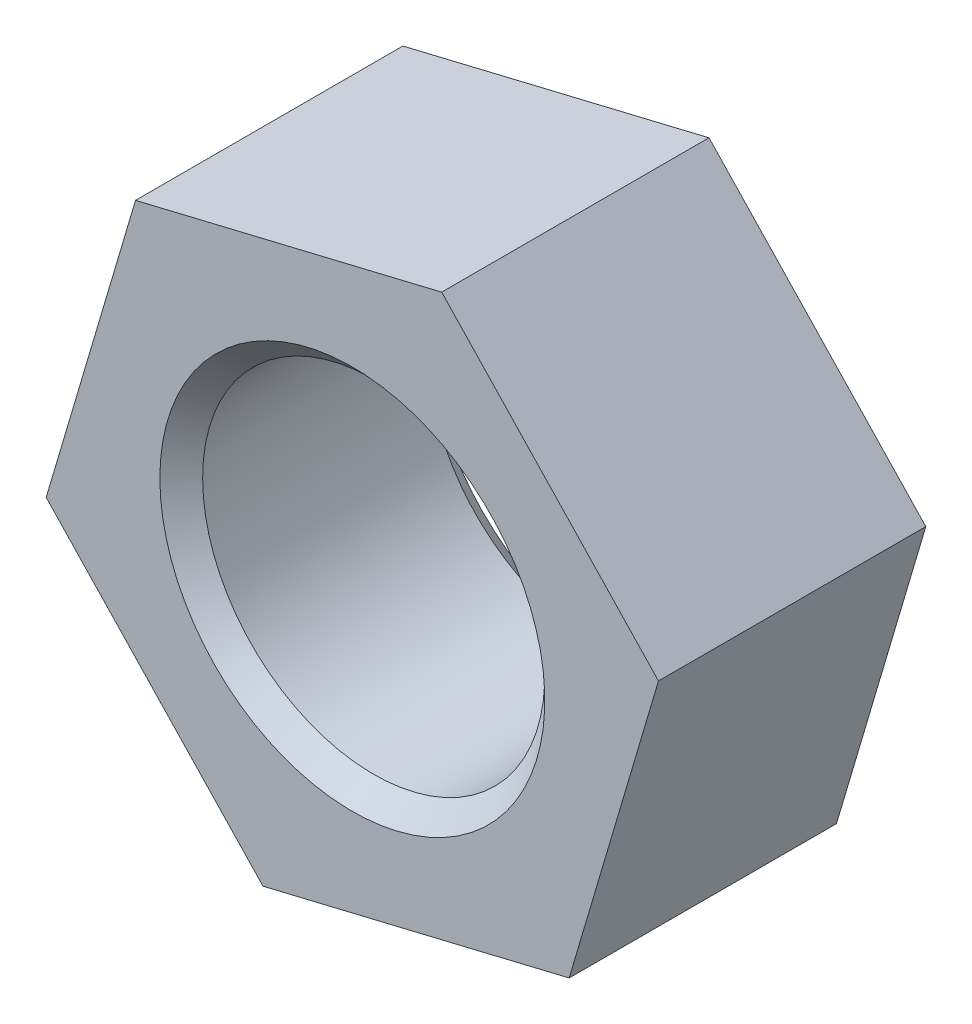
ISO-10303-21;
HEADER;
FILE_DESCRIPTION(('STEP AP214'),'2;1');
FILE_NAME('part.step','',(''),(''),'','','');
FILE_SCHEMA(('AUTOMOTIVE_DESIGN { 1 0 10303 214 1 1 1 1 }'));
ENDSEC;
DATA;
#1=APPLICATION_CONTEXT('core data for automotive mechanical design processes');
#2=APPLICATION_PROTOCOL_DEFINITION('international standard','automotive_design',2000,#1);
#3=PRODUCT_CONTEXT('',#1,'mechanical');
#4=PRODUCT('Part','Part','',(#3));
#5=PRODUCT_RELATED_PRODUCT_CATEGORY('part','',(#4));
#6=PRODUCT_DEFINITION_FORMATION('','',#4);
#7=PRODUCT_DEFINITION_CONTEXT('part definition',#1,'design');
#8=PRODUCT_DEFINITION('design','',#6,#7);
#9=PRODUCT_DEFINITION_SHAPE('','',#8);
#10=(LENGTH_UNIT() NAMED_UNIT(*) SI_UNIT(.MILLI.,.METRE.));
#11=(NAMED_UNIT(*) PLANE_ANGLE_UNIT() SI_UNIT($,.RADIAN.));
#12=(NAMED_UNIT(*) SI_UNIT($,.STERADIAN.) SOLID_ANGLE_UNIT());
#13=UNCERTAINTY_MEASURE_WITH_UNIT(LENGTH_MEASURE(1.E-05),#10,'distance_accuracy_value','');
#14=(GEOMETRIC_REPRESENTATION_CONTEXT(3) GLOBAL_UNCERTAINTY_ASSIGNED_CONTEXT((#13)) GLOBAL_UNIT_ASSIGNED_CONTEXT((#10,
#11,#12)) REPRESENTATION_CONTEXT('',''));
#15=CARTESIAN_POINT('',(0.,0.,0.));
#16=DIRECTION('',(0.,0.,1.));
#17=DIRECTION('',(1.,0.,0.));
#18=AXIS2_PLACEMENT_3D('',#15,#16,#17);
#19=CARTESIAN_POINT('',(2.08874269396305,7.05865808482151,6.25));
#20=DIRECTION('',(0.,0.,-1.));
#21=DIRECTION('',(-1.,0.,0.));
#22=AXIS2_PLACEMENT_3D('',#19,#20,#21);
#23=PLANE('',#22);
#24=CARTESIAN_POINT('',(0.,0.,6.25));
#25=DIRECTION('',(0.,0.,-1.));
#26=DIRECTION('',(-1.,0.,0.));
#27=AXIS2_PLACEMENT_3D('',#24,#25,#26);
#28=CIRCLE('',#27,4.5);
#29=CARTESIAN_POINT('',(-4.5,0.,6.25));
#30=VERTEX_POINT('',#29);
#31=EDGE_CURVE('E11',#30,#30,#28,.T.);
#32=ORIENTED_EDGE('',*,*,#31,.T.);
#33=EDGE_LOOP('',(#32));
#34=FACE_BOUND('',#33,.T.);
#35=DIRECTION('',(-0.972305204876345,-0.233714758991315,0.));
#36=VECTOR('',#35,1.);
#37=CARTESIAN_POINT('',(2.08874269396305,7.05865808482151,6.25));
#38=LINE('',#37,#36);
#39=CARTESIAN_POINT('',(2.08874269396305,7.05865808482151,6.25));
#40=VERTEX_POINT('',#39);
#41=CARTESIAN_POINT('',(-5.06860587110231,5.3382332773519,6.25));
#42=VERTEX_POINT('',#41);
#43=EDGE_CURVE('E128',#40,#42,#38,.T.);
#44=ORIENTED_EDGE('',*,*,#43,.T.);
#45=DIRECTION('',(-0.283749683912336,-0.958898387150406,0.));
#46=VECTOR('',#45,1.);
#47=CARTESIAN_POINT('',(-5.06860587110231,5.3382332773519,6.25));
#48=LINE('',#47,#46);
#49=CARTESIAN_POINT('',(-7.15734856506536,-1.72042480746961,6.25));
#50=VERTEX_POINT('',#49);
#51=EDGE_CURVE('E88',#42,#50,#48,.T.);
#52=ORIENTED_EDGE('',*,*,#51,.T.);
#53=DIRECTION('',(0.688555520964009,-0.72518362815909,0.));
#54=VECTOR('',#53,1.);
#55=CARTESIAN_POINT('',(-7.15734856506536,-1.72042480746961,6.25));
#56=LINE('',#55,#54);
#57=CARTESIAN_POINT('',(-2.08874269396304,-7.05865808482151,6.25));
#58=VERTEX_POINT('',#57);
#59=EDGE_CURVE('E100',#50,#58,#56,.T.);
#60=ORIENTED_EDGE('',*,*,#59,.T.);
#61=DIRECTION('',(0.972305204876345,0.233714758991315,0.));
#62=VECTOR('',#61,1.);
#63=CARTESIAN_POINT('',(-2.08874269396304,-7.05865808482151,6.25));
#64=LINE('',#63,#62);
#65=CARTESIAN_POINT('',(5.06860587110232,-5.3382332773519,6.25));
#66=VERTEX_POINT('',#65);
#67=EDGE_CURVE('E95',#58,#66,#64,.T.);
#68=ORIENTED_EDGE('',*,*,#67,.T.);
#69=DIRECTION('',(0.283749683912336,0.958898387150406,0.));
#70=VECTOR('',#69,1.);
#71=CARTESIAN_POINT('',(5.06860587110232,-5.3382332773519,6.25));
#72=LINE('',#71,#70);
#73=CARTESIAN_POINT('',(7.15734856506536,1.72042480746961,6.25));
#74=VERTEX_POINT('',#73);
#75=EDGE_CURVE('E98',#66,#74,#72,.T.);
#76=ORIENTED_EDGE('',*,*,#75,.T.);
#77=DIRECTION('',(-0.688555520964009,0.725183628159091,0.));
#78=VECTOR('',#77,1.);
#79=CARTESIAN_POINT('',(7.15734856506536,1.72042480746961,6.25));
#80=LINE('',#79,#78);
#81=EDGE_CURVE('E50',#74,#40,#80,.T.);
#82=ORIENTED_EDGE('',*,*,#81,.T.);
#83=EDGE_LOOP('',(#44,#52,#60,#68,#76,#82));
#84=FACE_BOUND('',#83,.T.);
#85=ADVANCED_FACE('F33',(#34,#84),#23,.F.);
#86=CARTESIAN_POINT('',(2.08874269396305,7.05865808482151,0.));
#87=DIRECTION('',(0.,0.,-1.));
#88=DIRECTION('',(-1.,0.,0.));
#89=AXIS2_PLACEMENT_3D('',#86,#87,#88);
#90=PLANE('',#89);
#91=CARTESIAN_POINT('',(0.,0.,0.));
#92=DIRECTION('',(0.,0.,-1.));
#93=DIRECTION('',(-1.,0.,0.));
#94=AXIS2_PLACEMENT_3D('',#91,#92,#93);
#95=CIRCLE('',#94,4.5);
#96=CARTESIAN_POINT('',(-4.5,0.,0.));
#97=VERTEX_POINT('',#96);
#98=EDGE_CURVE('E137',#97,#97,#95,.F.);
#99=ORIENTED_EDGE('',*,*,#98,.T.);
#100=EDGE_LOOP('',(#99));
#101=FACE_BOUND('',#100,.T.);
#102=DIRECTION('',(-0.972305204876345,-0.233714758991315,0.));
#103=VECTOR('',#102,1.);
#104=CARTESIAN_POINT('',(2.08874269396305,7.05865808482151,0.));
#105=LINE('',#104,#103);
#106=CARTESIAN_POINT('',(2.08874269396305,7.05865808482151,0.));
#107=VERTEX_POINT('',#106);
#108=CARTESIAN_POINT('',(-5.06860587110231,5.3382332773519,0.));
#109=VERTEX_POINT('',#108);
#110=EDGE_CURVE('E118',#107,#109,#105,.T.);
#111=ORIENTED_EDGE('',*,*,#110,.F.);
#112=DIRECTION('',(-0.688555520964009,0.725183628159091,0.));
#113=VECTOR('',#112,1.);
#114=CARTESIAN_POINT('',(7.15734856506536,1.72042480746961,0.));
#115=LINE('',#114,#113);
#116=CARTESIAN_POINT('',(7.15734856506536,1.72042480746961,0.));
#117=VERTEX_POINT('',#116);
#118=EDGE_CURVE('E79',#117,#107,#115,.T.);
#119=ORIENTED_EDGE('',*,*,#118,.F.);
#120=DIRECTION('',(0.283749683912336,0.958898387150406,0.));
#121=VECTOR('',#120,1.);
#122=CARTESIAN_POINT('',(5.06860587110232,-5.3382332773519,0.));
#123=LINE('',#122,#121);
#124=CARTESIAN_POINT('',(5.06860587110232,-5.3382332773519,0.));
#125=VERTEX_POINT('',#124);
#126=EDGE_CURVE('E73',#125,#117,#123,.T.);
#127=ORIENTED_EDGE('',*,*,#126,.F.);
#128=DIRECTION('',(0.972305204876345,0.233714758991315,0.));
#129=VECTOR('',#128,1.);
#130=CARTESIAN_POINT('',(-2.08874269396304,-7.05865808482151,0.));
#131=LINE('',#130,#129);
#132=CARTESIAN_POINT('',(-2.08874269396304,-7.05865808482151,0.));
#133=VERTEX_POINT('',#132);
#134=EDGE_CURVE('E108',#133,#125,#131,.T.);
#135=ORIENTED_EDGE('',*,*,#134,.F.);
#136=DIRECTION('',(0.688555520964009,-0.72518362815909,0.));
#137=VECTOR('',#136,1.);
#138=CARTESIAN_POINT('',(-7.15734856506536,-1.72042480746961,0.));
#139=LINE('',#138,#137);
#140=CARTESIAN_POINT('',(-7.15734856506536,-1.72042480746961,0.));
#141=VERTEX_POINT('',#140);
#142=EDGE_CURVE('E123',#141,#133,#139,.T.);
#143=ORIENTED_EDGE('',*,*,#142,.F.);
#144=DIRECTION('',(-0.283749683912336,-0.958898387150406,0.));
#145=VECTOR('',#144,1.);
#146=CARTESIAN_POINT('',(-5.06860587110231,5.3382332773519,0.));
#147=LINE('',#146,#145);
#148=EDGE_CURVE('E121',#109,#141,#147,.T.);
#149=ORIENTED_EDGE('',*,*,#148,.F.);
#150=EDGE_LOOP('',(#111,#119,#127,#135,#143,#149));
#151=FACE_BOUND('',#150,.T.);
#152=ADVANCED_FACE('F153',(#101,#151),#90,.T.);
#153=CARTESIAN_POINT('',(2.08874269396305,7.05865808482151,6.25));
#154=DIRECTION('',(0.233714758991315,-0.972305204876345,0.));
#155=DIRECTION('',(0.972305204876345,0.233714758991315,0.));
#156=AXIS2_PLACEMENT_3D('',#153,#154,#155);
#157=PLANE('',#156);
#158=ORIENTED_EDGE('',*,*,#110,.T.);
#159=DIRECTION('',(0.,0.,-1.));
#160=VECTOR('',#159,1.);
#161=CARTESIAN_POINT('',(-5.06860587110231,5.3382332773519,6.25));
#162=LINE('',#161,#160);
#163=EDGE_CURVE('E135',#42,#109,#162,.T.);
#164=ORIENTED_EDGE('',*,*,#163,.F.);
#165=ORIENTED_EDGE('',*,*,#43,.F.);
#166=DIRECTION('',(0.,0.,-1.));
#167=VECTOR('',#166,1.);
#168=CARTESIAN_POINT('',(2.08874269396305,7.05865808482151,6.25));
#169=LINE('',#168,#167);
#170=EDGE_CURVE('E114',#40,#107,#169,.T.);
#171=ORIENTED_EDGE('',*,*,#170,.T.);
#172=EDGE_LOOP('',(#158,#164,#165,#171));
#173=FACE_BOUND('',#172,.T.);
#174=ADVANCED_FACE('F156',(#173),#157,.F.);
#175=CARTESIAN_POINT('',(-5.06860587110231,5.3382332773519,6.25));
#176=DIRECTION('',(0.958898387150406,-0.283749683912336,0.));
#177=DIRECTION('',(0.283749683912336,0.958898387150406,0.));
#178=AXIS2_PLACEMENT_3D('',#175,#176,#177);
#179=PLANE('',#178);
#180=ORIENTED_EDGE('',*,*,#148,.T.);
#181=DIRECTION('',(0.,0.,-1.));
#182=VECTOR('',#181,1.);
#183=CARTESIAN_POINT('',(-7.15734856506536,-1.72042480746961,6.25));
#184=LINE('',#183,#182);
#185=EDGE_CURVE('E132',#50,#141,#184,.T.);
#186=ORIENTED_EDGE('',*,*,#185,.F.);
#187=ORIENTED_EDGE('',*,*,#51,.F.);
#188=ORIENTED_EDGE('',*,*,#163,.T.);
#189=EDGE_LOOP('',(#180,#186,#187,#188));
#190=FACE_BOUND('',#189,.T.);
#191=ADVANCED_FACE('F232',(#190),#179,.F.);
#192=CARTESIAN_POINT('',(-7.15734856506536,-1.72042480746961,6.25));
#193=DIRECTION('',(0.72518362815909,0.688555520964009,0.));
#194=DIRECTION('',(-0.688555520964009,0.72518362815909,0.));
#195=AXIS2_PLACEMENT_3D('',#192,#193,#194);
#196=PLANE('',#195);
#197=ORIENTED_EDGE('',*,*,#142,.T.);
#198=DIRECTION('',(0.,0.,-1.));
#199=VECTOR('',#198,1.);
#200=CARTESIAN_POINT('',(-2.08874269396304,-7.05865808482151,6.25));
#201=LINE('',#200,#199);
#202=EDGE_CURVE('E109',#58,#133,#201,.T.);
#203=ORIENTED_EDGE('',*,*,#202,.F.);
#204=ORIENTED_EDGE('',*,*,#59,.F.);
#205=ORIENTED_EDGE('',*,*,#185,.T.);
#206=EDGE_LOOP('',(#197,#203,#204,#205));
#207=FACE_BOUND('',#206,.T.);
#208=ADVANCED_FACE('F223',(#207),#196,.F.);
#209=CARTESIAN_POINT('',(-2.08874269396304,-7.05865808482151,6.25));
#210=DIRECTION('',(-0.233714758991315,0.972305204876345,0.));
#211=DIRECTION('',(-0.972305204876345,-0.233714758991315,0.));
#212=AXIS2_PLACEMENT_3D('',#209,#210,#211);
#213=PLANE('',#212);
#214=ORIENTED_EDGE('',*,*,#134,.T.);
#215=DIRECTION('',(0.,0.,-1.));
#216=VECTOR('',#215,1.);
#217=CARTESIAN_POINT('',(5.06860587110232,-5.3382332773519,6.25));
#218=LINE('',#217,#216);
#219=EDGE_CURVE('E105',#66,#125,#218,.T.);
#220=ORIENTED_EDGE('',*,*,#219,.F.);
#221=ORIENTED_EDGE('',*,*,#67,.F.);
#222=ORIENTED_EDGE('',*,*,#202,.T.);
#223=EDGE_LOOP('',(#214,#220,#221,#222));
#224=FACE_BOUND('',#223,.T.);
#225=ADVANCED_FACE('F106',(#224),#213,.F.);
#226=CARTESIAN_POINT('',(5.06860587110232,-5.3382332773519,6.25));
#227=DIRECTION('',(-0.958898387150406,0.283749683912336,0.));
#228=DIRECTION('',(-0.283749683912336,-0.958898387150406,0.));
#229=AXIS2_PLACEMENT_3D('',#226,#227,#228);
#230=PLANE('',#229);
#231=ORIENTED_EDGE('',*,*,#126,.T.);
#232=DIRECTION('',(0.,0.,-1.));
#233=VECTOR('',#232,1.);
#234=CARTESIAN_POINT('',(7.15734856506536,1.72042480746961,6.25));
#235=LINE('',#234,#233);
#236=EDGE_CURVE('E110',#74,#117,#235,.T.);
#237=ORIENTED_EDGE('',*,*,#236,.F.);
#238=ORIENTED_EDGE('',*,*,#75,.F.);
#239=ORIENTED_EDGE('',*,*,#219,.T.);
#240=EDGE_LOOP('',(#231,#237,#238,#239));
#241=FACE_BOUND('',#240,.T.);
#242=ADVANCED_FACE('F112',(#241),#230,.F.);
#243=CARTESIAN_POINT('',(7.15734856506536,1.72042480746961,6.25));
#244=DIRECTION('',(-0.725183628159091,-0.688555520964009,0.));
#245=DIRECTION('',(0.688555520964009,-0.725183628159091,0.));
#246=AXIS2_PLACEMENT_3D('',#243,#244,#245);
#247=PLANE('',#246);
#248=ORIENTED_EDGE('',*,*,#118,.T.);
#249=ORIENTED_EDGE('',*,*,#170,.F.);
#250=ORIENTED_EDGE('',*,*,#81,.F.);
#251=ORIENTED_EDGE('',*,*,#236,.T.);
#252=EDGE_LOOP('',(#248,#249,#250,#251));
#253=FACE_BOUND('',#252,.T.);
#254=ADVANCED_FACE('F163',(#253),#247,.F.);
#255=CARTESIAN_POINT('',(0.,0.,6.25));
#256=DIRECTION('',(0.,0.,-1.));
#257=DIRECTION('',(-1.,0.,0.));
#258=AXIS2_PLACEMENT_3D('',#255,#256,#257);
#259=CYLINDRICAL_SURFACE('',#258,4.);
#260=CARTESIAN_POINT('',(0.,0.,0.5));
#261=DIRECTION('',(0.,0.,-1.));
#262=DIRECTION('',(-1.,0.,0.));
#263=AXIS2_PLACEMENT_3D('',#260,#261,#262);
#264=CIRCLE('',#263,4.);
#265=CARTESIAN_POINT('',(-4.,0.,0.5));
#266=VERTEX_POINT('',#265);
#267=EDGE_CURVE('E42',#266,#266,#264,.T.);
#268=ORIENTED_EDGE('',*,*,#267,.T.);
#269=EDGE_LOOP('',(#268));
#270=FACE_BOUND('',#269,.T.);
#271=CARTESIAN_POINT('',(0.,0.,5.75));
#272=DIRECTION('',(0.,0.,-1.));
#273=DIRECTION('',(-1.,0.,0.));
#274=AXIS2_PLACEMENT_3D('',#271,#272,#273);
#275=CIRCLE('',#274,4.);
#276=CARTESIAN_POINT('',(-4.,0.,5.75));
#277=VERTEX_POINT('',#276);
#278=EDGE_CURVE('E140',#277,#277,#275,.F.);
#279=ORIENTED_EDGE('',*,*,#278,.T.);
#280=EDGE_LOOP('',(#279));
#281=FACE_BOUND('',#280,.T.);
#282=ADVANCED_FACE('F145',(#270,#281),#259,.F.);
#283=CARTESIAN_POINT('',(0.,0.,0.));
#284=DIRECTION('',(0.,0.,-1.));
#285=DIRECTION('',(-1.,0.,0.));
#286=AXIS2_PLACEMENT_3D('',#283,#284,#285);
#287=CONICAL_SURFACE('',#286,4.5,0.785398163397448);
#288=ORIENTED_EDGE('',*,*,#267,.F.);
#289=EDGE_LOOP('',(#288));
#290=FACE_BOUND('',#289,.T.);
#291=ORIENTED_EDGE('',*,*,#98,.F.);
#292=EDGE_LOOP('',(#291));
#293=FACE_BOUND('',#292,.T.);
#294=ADVANCED_FACE('F148',(#290,#293),#287,.F.);
#295=CARTESIAN_POINT('',(0.,0.,5.75));
#296=DIRECTION('',(0.,0.,1.));
#297=DIRECTION('',(1.,0.,0.));
#298=AXIS2_PLACEMENT_3D('',#295,#296,#297);
#299=CONICAL_SURFACE('',#298,4.,0.785398163397452);
#300=ORIENTED_EDGE('',*,*,#31,.F.);
#301=EDGE_LOOP('',(#300));
#302=FACE_BOUND('',#301,.T.);
#303=ORIENTED_EDGE('',*,*,#278,.F.);
#304=EDGE_LOOP('',(#303));
#305=FACE_BOUND('',#304,.T.);
#306=ADVANCED_FACE('F35',(#302,#305),#299,.F.);
#307=CLOSED_SHELL('',(#85,#152,#174,#191,#208,#225,#242,#254,#282,#294,#306));
#308=MANIFOLD_SOLID_BREP('B2',#307);
#309=ADVANCED_BREP_SHAPE_REPRESENTATION('',(#18,#308),#14);
#310=SHAPE_DEFINITION_REPRESENTATION(#9,#309);
ENDSEC;
END-ISO-10303-21;
